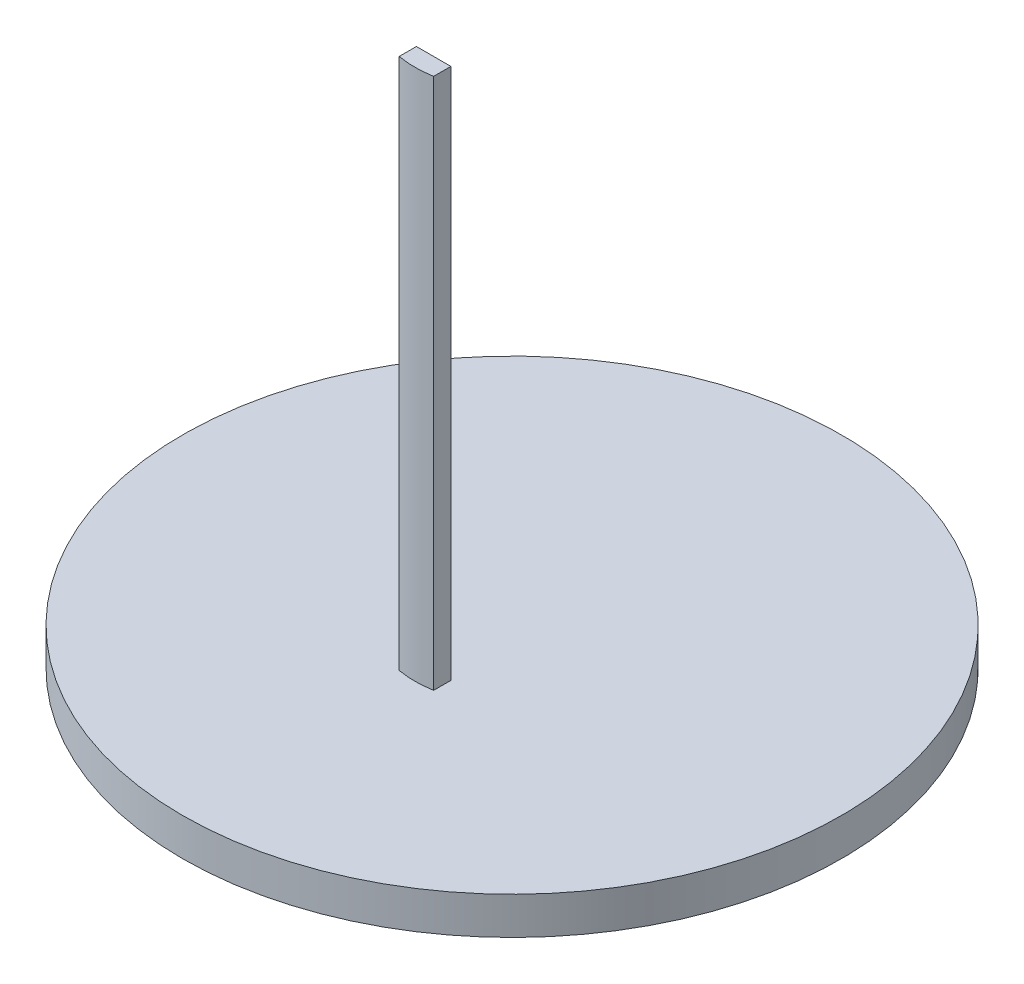
ISO-10303-21;
HEADER;
FILE_DESCRIPTION(('STEP AP214'),'2;1');
FILE_NAME('part.step','',(''),(''),'','','');
FILE_SCHEMA(('AUTOMOTIVE_DESIGN { 1 0 10303 214 1 1 1 1 }'));
ENDSEC;
DATA;
#1=APPLICATION_CONTEXT('core data for automotive mechanical design processes');
#2=APPLICATION_PROTOCOL_DEFINITION('international standard','automotive_design',2000,#1);
#3=PRODUCT_CONTEXT('',#1,'mechanical');
#4=PRODUCT('Part','Part','',(#3));
#5=PRODUCT_RELATED_PRODUCT_CATEGORY('part','',(#4));
#6=PRODUCT_DEFINITION_FORMATION('','',#4);
#7=PRODUCT_DEFINITION_CONTEXT('part definition',#1,'design');
#8=PRODUCT_DEFINITION('design','',#6,#7);
#9=PRODUCT_DEFINITION_SHAPE('','',#8);
#10=(LENGTH_UNIT() NAMED_UNIT(*) SI_UNIT(.MILLI.,.METRE.));
#11=(NAMED_UNIT(*) PLANE_ANGLE_UNIT() SI_UNIT($,.RADIAN.));
#12=(NAMED_UNIT(*) SI_UNIT($,.STERADIAN.) SOLID_ANGLE_UNIT());
#13=UNCERTAINTY_MEASURE_WITH_UNIT(LENGTH_MEASURE(1.E-05),#10,'distance_accuracy_value','');
#14=(GEOMETRIC_REPRESENTATION_CONTEXT(3) GLOBAL_UNCERTAINTY_ASSIGNED_CONTEXT((#13)) GLOBAL_UNIT_ASSIGNED_CONTEXT((#10,
#11,#12)) REPRESENTATION_CONTEXT('',''));
#15=CARTESIAN_POINT('',(0.,0.,0.));
#16=DIRECTION('',(0.,0.,1.));
#17=DIRECTION('',(1.,0.,0.));
#18=AXIS2_PLACEMENT_3D('',#15,#16,#17);
#19=CARTESIAN_POINT('',(0.,10.,0.));
#20=DIRECTION('',(0.,-1.,0.));
#21=DIRECTION('',(0.,0.,-1.));
#22=AXIS2_PLACEMENT_3D('',#19,#20,#21);
#23=CYLINDRICAL_SURFACE('',#22,88.0099863910161);
#24=CARTESIAN_POINT('',(0.,10.,0.));
#25=DIRECTION('',(0.,1.,0.));
#26=DIRECTION('',(0.,0.,1.));
#27=AXIS2_PLACEMENT_3D('',#24,#25,#26);
#28=CIRCLE('',#27,88.0099863910161);
#29=CARTESIAN_POINT('',(0.,10.,88.0099863910161));
#30=VERTEX_POINT('',#29);
#31=EDGE_CURVE('E11',#30,#30,#28,.T.);
#32=ORIENTED_EDGE('',*,*,#31,.F.);
#33=EDGE_LOOP('',(#32));
#34=FACE_BOUND('',#33,.T.);
#35=CARTESIAN_POINT('',(0.,0.,0.));
#36=DIRECTION('',(0.,1.,0.));
#37=DIRECTION('',(0.,0.,1.));
#38=AXIS2_PLACEMENT_3D('',#35,#36,#37);
#39=CIRCLE('',#38,88.0099863910161);
#40=CARTESIAN_POINT('',(0.,0.,88.0099863910161));
#41=VERTEX_POINT('',#40);
#42=EDGE_CURVE('E48',#41,#41,#39,.T.);
#43=ORIENTED_EDGE('',*,*,#42,.T.);
#44=EDGE_LOOP('',(#43));
#45=FACE_BOUND('',#44,.T.);
#46=ADVANCED_FACE('F45',(#34,#45),#23,.T.);
#47=CARTESIAN_POINT('',(0.,10.,0.));
#48=DIRECTION('',(0.,1.,0.));
#49=DIRECTION('',(0.,0.,1.));
#50=AXIS2_PLACEMENT_3D('',#47,#48,#49);
#51=PLANE('',#50);
#52=DIRECTION('',(0.,0.,-1.));
#53=VECTOR('',#52,1.);
#54=CARTESIAN_POINT('',(-4.6,10.,0.));
#55=LINE('',#54,#53);
#56=CARTESIAN_POINT('',(-4.6,10.,25.5491995960735));
#57=VERTEX_POINT('',#56);
#58=CARTESIAN_POINT('',(-4.6,10.,20.945));
#59=VERTEX_POINT('',#58);
#60=EDGE_CURVE('E91',#57,#59,#55,.T.);
#61=ORIENTED_EDGE('',*,*,#60,.T.);
#62=DIRECTION('',(1.,0.,0.));
#63=VECTOR('',#62,1.);
#64=CARTESIAN_POINT('',(0.,10.,20.945));
#65=LINE('',#64,#63);
#66=CARTESIAN_POINT('',(4.6,10.,20.945));
#67=VERTEX_POINT('',#66);
#68=EDGE_CURVE('E109',#59,#67,#65,.T.);
#69=ORIENTED_EDGE('',*,*,#68,.T.);
#70=DIRECTION('',(0.,0.,-1.));
#71=VECTOR('',#70,1.);
#72=CARTESIAN_POINT('',(4.6,10.,0.));
#73=LINE('',#72,#71);
#74=CARTESIAN_POINT('',(4.6,10.,25.5491995960735));
#75=VERTEX_POINT('',#74);
#76=EDGE_CURVE('E65',#75,#67,#73,.T.);
#77=ORIENTED_EDGE('',*,*,#76,.F.);
#78=CARTESIAN_POINT('',(0.,10.,0.));
#79=DIRECTION('',(0.,1.,0.));
#80=DIRECTION('',(0.,0.,1.));
#81=AXIS2_PLACEMENT_3D('',#78,#79,#80);
#82=CIRCLE('',#81,25.96);
#83=EDGE_CURVE('E60',#57,#75,#82,.T.);
#84=ORIENTED_EDGE('',*,*,#83,.F.);
#85=EDGE_LOOP('',(#61,#69,#77,#84));
#86=FACE_BOUND('',#85,.T.);
#87=ORIENTED_EDGE('',*,*,#31,.T.);
#88=EDGE_LOOP('',(#87));
#89=FACE_BOUND('',#88,.T.);
#90=ADVANCED_FACE('F138',(#86,#89),#51,.T.);
#91=CARTESIAN_POINT('',(0.,0.,0.));
#92=DIRECTION('',(0.,1.,0.));
#93=DIRECTION('',(0.,0.,1.));
#94=AXIS2_PLACEMENT_3D('',#91,#92,#93);
#95=PLANE('',#94);
#96=ORIENTED_EDGE('',*,*,#42,.F.);
#97=EDGE_LOOP('',(#96));
#98=FACE_BOUND('',#97,.T.);
#99=ADVANCED_FACE('F141',(#98),#95,.F.);
#100=CARTESIAN_POINT('',(-4.6,152.,0.));
#101=DIRECTION('',(-1.,0.,0.));
#102=DIRECTION('',(0.,0.,1.));
#103=AXIS2_PLACEMENT_3D('',#100,#101,#102);
#104=PLANE('',#103);
#105=ORIENTED_EDGE('',*,*,#60,.F.);
#106=DIRECTION('',(0.,-1.,0.));
#107=VECTOR('',#106,1.);
#108=CARTESIAN_POINT('',(-4.6,152.,25.5491995960735));
#109=LINE('',#108,#107);
#110=CARTESIAN_POINT('',(-4.6,152.,25.5491995960735));
#111=VERTEX_POINT('',#110);
#112=EDGE_CURVE('E84',#111,#57,#109,.T.);
#113=ORIENTED_EDGE('',*,*,#112,.F.);
#114=DIRECTION('',(0.,0.,-1.));
#115=VECTOR('',#114,1.);
#116=CARTESIAN_POINT('',(-4.6,152.,0.));
#117=LINE('',#116,#115);
#118=CARTESIAN_POINT('',(-4.6,152.,20.945));
#119=VERTEX_POINT('',#118);
#120=EDGE_CURVE('E89',#111,#119,#117,.T.);
#121=ORIENTED_EDGE('',*,*,#120,.T.);
#122=DIRECTION('',(0.,-1.,0.));
#123=VECTOR('',#122,1.);
#124=CARTESIAN_POINT('',(-4.6,152.,20.945));
#125=LINE('',#124,#123);
#126=EDGE_CURVE('E118',#119,#59,#125,.T.);
#127=ORIENTED_EDGE('',*,*,#126,.T.);
#128=EDGE_LOOP('',(#105,#113,#121,#127));
#129=FACE_BOUND('',#128,.T.);
#130=ADVANCED_FACE('F86',(#129),#104,.T.);
#131=CARTESIAN_POINT('',(0.,152.,0.));
#132=DIRECTION('',(0.,-1.,0.));
#133=DIRECTION('',(0.,0.,-1.));
#134=AXIS2_PLACEMENT_3D('',#131,#132,#133);
#135=CYLINDRICAL_SURFACE('',#134,25.96);
#136=ORIENTED_EDGE('',*,*,#83,.T.);
#137=DIRECTION('',(0.,-1.,0.));
#138=VECTOR('',#137,1.);
#139=CARTESIAN_POINT('',(4.6,152.,25.5491995960735));
#140=LINE('',#139,#138);
#141=CARTESIAN_POINT('',(4.6,152.,25.5491995960735));
#142=VERTEX_POINT('',#141);
#143=EDGE_CURVE('E94',#142,#75,#140,.T.);
#144=ORIENTED_EDGE('',*,*,#143,.F.);
#145=CARTESIAN_POINT('',(0.,152.,0.));
#146=DIRECTION('',(0.,1.,0.));
#147=DIRECTION('',(0.,0.,1.));
#148=AXIS2_PLACEMENT_3D('',#145,#146,#147);
#149=CIRCLE('',#148,25.96);
#150=EDGE_CURVE('E97',#111,#142,#149,.T.);
#151=ORIENTED_EDGE('',*,*,#150,.F.);
#152=ORIENTED_EDGE('',*,*,#112,.T.);
#153=EDGE_LOOP('',(#136,#144,#151,#152));
#154=FACE_BOUND('',#153,.T.);
#155=ADVANCED_FACE('F98',(#154),#135,.T.);
#156=CARTESIAN_POINT('',(4.6,152.,0.));
#157=DIRECTION('',(-1.,0.,0.));
#158=DIRECTION('',(0.,0.,1.));
#159=AXIS2_PLACEMENT_3D('',#156,#157,#158);
#160=PLANE('',#159);
#161=ORIENTED_EDGE('',*,*,#76,.T.);
#162=DIRECTION('',(0.,-1.,0.));
#163=VECTOR('',#162,1.);
#164=CARTESIAN_POINT('',(4.6,152.,20.945));
#165=LINE('',#164,#163);
#166=CARTESIAN_POINT('',(4.6,152.,20.945));
#167=VERTEX_POINT('',#166);
#168=EDGE_CURVE('E127',#167,#67,#165,.T.);
#169=ORIENTED_EDGE('',*,*,#168,.F.);
#170=DIRECTION('',(0.,0.,-1.));
#171=VECTOR('',#170,1.);
#172=CARTESIAN_POINT('',(4.6,152.,0.));
#173=LINE('',#172,#171);
#174=EDGE_CURVE('E103',#142,#167,#173,.T.);
#175=ORIENTED_EDGE('',*,*,#174,.F.);
#176=ORIENTED_EDGE('',*,*,#143,.T.);
#177=EDGE_LOOP('',(#161,#169,#175,#176));
#178=FACE_BOUND('',#177,.T.);
#179=ADVANCED_FACE('F133',(#178),#160,.F.);
#180=CARTESIAN_POINT('',(0.,152.,20.945));
#181=DIRECTION('',(0.,0.,-1.));
#182=DIRECTION('',(-1.,0.,0.));
#183=AXIS2_PLACEMENT_3D('',#180,#181,#182);
#184=PLANE('',#183);
#185=ORIENTED_EDGE('',*,*,#68,.F.);
#186=ORIENTED_EDGE('',*,*,#126,.F.);
#187=DIRECTION('',(1.,0.,0.));
#188=VECTOR('',#187,1.);
#189=CARTESIAN_POINT('',(0.,152.,20.945));
#190=LINE('',#189,#188);
#191=EDGE_CURVE('E107',#119,#167,#190,.T.);
#192=ORIENTED_EDGE('',*,*,#191,.T.);
#193=ORIENTED_EDGE('',*,*,#168,.T.);
#194=EDGE_LOOP('',(#185,#186,#192,#193));
#195=FACE_BOUND('',#194,.T.);
#196=ADVANCED_FACE('F137',(#195),#184,.T.);
#197=CARTESIAN_POINT('',(0.,152.,0.));
#198=DIRECTION('',(0.,1.,0.));
#199=DIRECTION('',(0.,0.,1.));
#200=AXIS2_PLACEMENT_3D('',#197,#198,#199);
#201=PLANE('',#200);
#202=ORIENTED_EDGE('',*,*,#120,.F.);
#203=ORIENTED_EDGE('',*,*,#150,.T.);
#204=ORIENTED_EDGE('',*,*,#174,.T.);
#205=ORIENTED_EDGE('',*,*,#191,.F.);
#206=EDGE_LOOP('',(#202,#203,#204,#205));
#207=FACE_BOUND('',#206,.T.);
#208=ADVANCED_FACE('F105',(#207),#201,.T.);
#209=CLOSED_SHELL('',(#46,#90,#99,#130,#155,#179,#196,#208));
#210=MANIFOLD_SOLID_BREP('B2',#209);
#211=ADVANCED_BREP_SHAPE_REPRESENTATION('',(#18,#210),#14);
#212=SHAPE_DEFINITION_REPRESENTATION(#9,#211);
ENDSEC;
END-ISO-10303-21;
